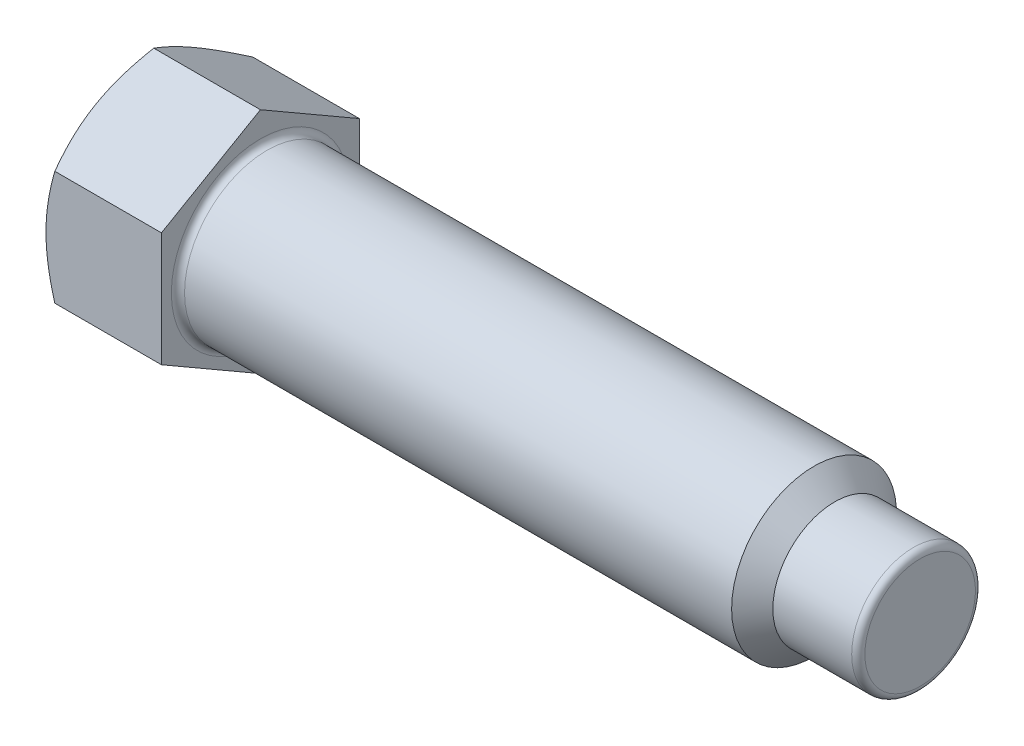
ISO-10303-21;
HEADER;
FILE_DESCRIPTION(('STEP AP214'),'2;1');
FILE_NAME('part.step','',(''),(''),'','','');
FILE_SCHEMA(('AUTOMOTIVE_DESIGN { 1 0 10303 214 1 1 1 1 }'));
ENDSEC;
DATA;
#1=APPLICATION_CONTEXT('core data for automotive mechanical design processes');
#2=APPLICATION_PROTOCOL_DEFINITION('international standard','automotive_design',2000,#1);
#3=PRODUCT_CONTEXT('',#1,'mechanical');
#4=PRODUCT('Part','Part','',(#3));
#5=PRODUCT_RELATED_PRODUCT_CATEGORY('part','',(#4));
#6=PRODUCT_DEFINITION_FORMATION('','',#4);
#7=PRODUCT_DEFINITION_CONTEXT('part definition',#1,'design');
#8=PRODUCT_DEFINITION('design','',#6,#7);
#9=PRODUCT_DEFINITION_SHAPE('','',#8);
#10=(LENGTH_UNIT() NAMED_UNIT(*) SI_UNIT(.MILLI.,.METRE.));
#11=(NAMED_UNIT(*) PLANE_ANGLE_UNIT() SI_UNIT($,.RADIAN.));
#12=(NAMED_UNIT(*) SI_UNIT($,.STERADIAN.) SOLID_ANGLE_UNIT());
#13=UNCERTAINTY_MEASURE_WITH_UNIT(LENGTH_MEASURE(1.E-05),#10,'distance_accuracy_value','');
#14=(GEOMETRIC_REPRESENTATION_CONTEXT(3) GLOBAL_UNCERTAINTY_ASSIGNED_CONTEXT((#13)) GLOBAL_UNIT_ASSIGNED_CONTEXT((#10,
#11,#12)) REPRESENTATION_CONTEXT('',''));
#15=CARTESIAN_POINT('',(0.,0.,0.));
#16=DIRECTION('',(0.,0.,1.));
#17=DIRECTION('',(1.,0.,0.));
#18=AXIS2_PLACEMENT_3D('',#15,#16,#17);
#19=CARTESIAN_POINT('',(14.,6.9282032302755,-12.));
#20=DIRECTION('',(0.,-0.866025403784438,0.500000000000001));
#21=DIRECTION('',(0.,-0.500000000000001,-0.866025403784438));
#22=AXIS2_PLACEMENT_3D('',#19,#20,#21);
#23=PLANE('',#22);
#24=CARTESIAN_POINT('',(1.07186343722447,13.8565219306049,0.0002));
#25=CARTESIAN_POINT('',(0.983949632185857,13.7042251307133,-0.263585795242263));
#26=CARTESIAN_POINT('',(0.900025997556664,13.5513604901482,-0.5283551193818));
#27=CARTESIAN_POINT('',(0.741266218872839,13.244405350712,-1.06001701652966));
#28=CARTESIAN_POINT('',(0.666433063673581,13.0903144663124,-1.32691025729307));
#29=CARTESIAN_POINT('',(0.457017539854151,12.6255589607763,-2.13189040597901));
#30=CARTESIAN_POINT('',(0.33790323672285,12.3130596590925,-2.6731550738251));
#31=CARTESIAN_POINT('',(0.198231061003145,11.8454187840152,-3.48313282915499));
#32=CARTESIAN_POINT('',(0.158443797040445,11.6916742921315,-3.74942610048137));
#33=CARTESIAN_POINT('',(0.091723369217091,11.3834734611381,-4.28324559869683));
#34=CARTESIAN_POINT('',(0.0647904527677748,11.2290171083848,-4.55077184921737));
#35=CARTESIAN_POINT('',(0.0244685919169245,10.9198468953819,-5.08627036632534));
#36=CARTESIAN_POINT('',(0.0110635528823167,10.7651335610083,-5.35424172206872));
#37=CARTESIAN_POINT('',(-0.00191690624283409,10.4555635369292,-5.89043273227403));
#38=CARTESIAN_POINT('',(-0.00149275363726694,10.3007068518009,-6.15865237880803));
#39=CARTESIAN_POINT('',(0.0122200193427709,10.011202064883,-6.6600893787841));
#40=CARTESIAN_POINT('',(0.0238359825785288,9.87653331649855,-6.89334249317775));
#41=CARTESIAN_POINT('',(0.0573080088723756,9.60750555673725,-7.35931224173076));
#42=CARTESIAN_POINT('',(0.0791647962662152,9.47314656794543,-7.59202883677176));
#43=CARTESIAN_POINT('',(0.132737416542906,9.20481134519089,-8.05679907604294));
#44=CARTESIAN_POINT('',(0.16446139249292,9.07083551994084,-8.288852012362));
#45=CARTESIAN_POINT('',(0.237211775670436,8.80351197901488,-8.75186996730497));
#46=CARTESIAN_POINT('',(0.278238815183194,8.67016430666066,-8.98283491089354));
#47=CARTESIAN_POINT('',(0.416311653281799,8.2653799638421,-9.68394195876366));
#48=CARTESIAN_POINT('',(0.52712488833932,7.99511549730955,-10.1520537462785));
#49=CARTESIAN_POINT('',(0.778625766937874,7.45861659251288,-11.0812971075914));
#50=CARTESIAN_POINT('',(0.919254342659372,7.19237528499142,-11.5424405792922));
#51=CARTESIAN_POINT('',(1.07186343722446,6.92808776022166,-12.0002));
#52=B_SPLINE_CURVE_WITH_KNOTS('',3,(#24,#25,#26,#27,#28,#29,#30,#31,#32,#33,#34,#35,#36,#37,#38,
#39,#40,#41,#42,#43,#44,#45,#46,#47,#48,#49,#50,#51),.UNSPECIFIED.,.F.,.F.,(4,2,2,2,2,2,2,2,2,2,
2,2,2,4),(0.,0.951004872251244,1.90232158356437,3.80900466161368,4.7389455141357,
5.66890426477609,6.59775529889865,7.5265776327693,8.33514643820578,9.14377244252749,
9.95306755799765,10.7624176939264,12.4167102786892,14.0677556316691),.UNSPECIFIED.);
#53=CARTESIAN_POINT('',(1.07179676972448,13.856406460551,0.));
#54=VERTEX_POINT('',#53);
#55=CARTESIAN_POINT('',(0.,10.3923048454133,-6.00000000000002));
#56=VERTEX_POINT('',#55);
#57=EDGE_CURVE('E47',#54,#56,#52,.T.);
#58=ORIENTED_EDGE('',*,*,#57,.F.);
#59=DIRECTION('',(-1.,0.,0.));
#60=VECTOR('',#59,1.);
#61=CARTESIAN_POINT('',(14.,13.856406460551,0.));
#62=LINE('',#61,#60);
#63=CARTESIAN_POINT('',(14.,13.856406460551,0.));
#64=VERTEX_POINT('',#63);
#65=EDGE_CURVE('E146',#64,#54,#62,.T.);
#66=ORIENTED_EDGE('',*,*,#65,.F.);
#67=DIRECTION('',(0.,0.500000000000001,0.866025403784438));
#68=VECTOR('',#67,1.);
#69=CARTESIAN_POINT('',(14.,6.9282032302755,-12.));
#70=LINE('',#69,#68);
#71=CARTESIAN_POINT('',(14.,6.9282032302755,-12.));
#72=VERTEX_POINT('',#71);
#73=EDGE_CURVE('E284',#72,#64,#70,.T.);
#74=ORIENTED_EDGE('',*,*,#73,.F.);
#75=DIRECTION('',(-1.,0.,0.));
#76=VECTOR('',#75,1.);
#77=CARTESIAN_POINT('',(14.,6.9282032302755,-12.));
#78=LINE('',#77,#76);
#79=CARTESIAN_POINT('',(1.07179676972447,6.9282032302755,-12.));
#80=VERTEX_POINT('',#79);
#81=EDGE_CURVE('E133',#72,#80,#78,.T.);
#82=ORIENTED_EDGE('',*,*,#81,.T.);
#83=EDGE_CURVE('E127',#56,#80,#52,.T.);
#84=ORIENTED_EDGE('',*,*,#83,.F.);
#85=EDGE_LOOP('',(#58,#66,#74,#82,#84));
#86=FACE_BOUND('',#85,.T.);
#87=ADVANCED_FACE('F32',(#86),#23,.F.);
#88=CARTESIAN_POINT('',(14.,13.856406460551,0.));
#89=DIRECTION('',(0.,-0.866025403784439,-0.5));
#90=DIRECTION('',(0.,0.5,-0.866025403784439));
#91=AXIS2_PLACEMENT_3D('',#88,#89,#90);
#92=PLANE('',#91);
#93=CARTESIAN_POINT('',(1.07186343722447,6.92808776022168,12.0002));
#94=CARTESIAN_POINT('',(0.983949632185856,7.0803845601132,11.7364142047577));
#95=CARTESIAN_POINT('',(0.900025997556663,7.23324920067831,11.4716448806182));
#96=CARTESIAN_POINT('',(0.741266218872838,7.5402043401145,10.9399829834703));
#97=CARTESIAN_POINT('',(0.666433063673581,7.69429522451415,10.6730897427069));
#98=CARTESIAN_POINT('',(0.457017539854151,8.15905073005028,9.86810959402099));
#99=CARTESIAN_POINT('',(0.337903236722851,8.47155003173405,9.3268449261749));
#100=CARTESIAN_POINT('',(0.198231061003146,8.93919090681138,8.51686717084501));
#101=CARTESIAN_POINT('',(0.158443797040447,9.09293539869505,8.25057389951863));
#102=CARTESIAN_POINT('',(0.0917233692170934,9.40113622968842,7.71675440130316));
#103=CARTESIAN_POINT('',(0.0647904527677778,9.55559258244174,7.44922815078262));
#104=CARTESIAN_POINT('',(0.024468591916929,9.86476279544467,6.91372963367465));
#105=CARTESIAN_POINT('',(0.0110635528823219,10.0194761298182,6.64575827793128));
#106=CARTESIAN_POINT('',(-0.00191690624282825,10.3290461538973,6.10956726772596));
#107=CARTESIAN_POINT('',(-0.00149275363726122,10.4839028390257,5.84134762119196));
#108=CARTESIAN_POINT('',(0.0122200193427771,10.7734076259435,5.3399106212159));
#109=CARTESIAN_POINT('',(0.0238359825785356,10.908076374328,5.10665750682225));
#110=CARTESIAN_POINT('',(0.057308008872383,11.1771041340893,4.64068775826924));
#111=CARTESIAN_POINT('',(0.0791647962662228,11.3114631228811,4.40797116322823));
#112=CARTESIAN_POINT('',(0.132737416542915,11.5797983456356,3.94320092395706));
#113=CARTESIAN_POINT('',(0.164461392492929,11.7137741708857,3.711147987638));
#114=CARTESIAN_POINT('',(0.237211775670445,11.9810977118116,3.24813003269502));
#115=CARTESIAN_POINT('',(0.278238815183202,12.1144453841659,3.01716508910646));
#116=CARTESIAN_POINT('',(0.416311653281805,12.5192297269844,2.31605804123633));
#117=CARTESIAN_POINT('',(0.527124888339327,12.789494193517,1.84794625372147));
#118=CARTESIAN_POINT('',(0.778625766937884,13.3259930983136,0.91870289240858));
#119=CARTESIAN_POINT('',(0.919254342659383,13.5922344058351,0.457559420707848));
#120=CARTESIAN_POINT('',(1.07186343722447,13.8565219306049,-0.000199999999998182));
#121=B_SPLINE_CURVE_WITH_KNOTS('',3,(#93,#94,#95,#96,#97,#98,#99,#100,#101,#102,#103,#104,#105,
#106,#107,#108,#109,#110,#111,#112,#113,#114,#115,#116,#117,#118,#119,#120),.UNSPECIFIED.,.F.,
.F.,(4,2,2,2,2,2,2,2,2,2,2,2,2,4),(0.,0.951004872251244,1.90232158356437,3.80900466161368,
4.7389455141357,5.66890426477609,6.59775529889865,7.5265776327693,8.33514643820578,
9.14377244252749,9.95306755799765,10.7624176939264,12.4167102786892,14.0677556316691),.UNSPECIFIED.);
#122=CARTESIAN_POINT('',(1.07179676972448,6.92820323027552,12.));
#123=VERTEX_POINT('',#122);
#124=CARTESIAN_POINT('',(0.,10.3923048454133,6.));
#125=VERTEX_POINT('',#124);
#126=EDGE_CURVE('E55',#123,#125,#121,.T.);
#127=ORIENTED_EDGE('',*,*,#126,.F.);
#128=DIRECTION('',(-1.,0.,0.));
#129=VECTOR('',#128,1.);
#130=CARTESIAN_POINT('',(14.,6.92820323027552,12.));
#131=LINE('',#130,#129);
#132=CARTESIAN_POINT('',(14.,6.92820323027552,12.));
#133=VERTEX_POINT('',#132);
#134=EDGE_CURVE('E143',#133,#123,#131,.T.);
#135=ORIENTED_EDGE('',*,*,#134,.F.);
#136=DIRECTION('',(0.,-0.5,0.866025403784439));
#137=VECTOR('',#136,1.);
#138=CARTESIAN_POINT('',(14.,13.856406460551,0.));
#139=LINE('',#138,#137);
#140=EDGE_CURVE('E286',#64,#133,#139,.T.);
#141=ORIENTED_EDGE('',*,*,#140,.F.);
#142=ORIENTED_EDGE('',*,*,#65,.T.);
#143=EDGE_CURVE('E221',#125,#54,#121,.T.);
#144=ORIENTED_EDGE('',*,*,#143,.F.);
#145=EDGE_LOOP('',(#127,#135,#141,#142,#144));
#146=FACE_BOUND('',#145,.T.);
#147=ADVANCED_FACE('F173',(#146),#92,.F.);
#148=CARTESIAN_POINT('',(14.,6.92820323027552,12.));
#149=DIRECTION('',(0.,0.,-1.));
#150=DIRECTION('',(-1.,0.,0.));
#151=AXIS2_PLACEMENT_3D('',#148,#149,#150);
#152=PLANE('',#151);
#153=CARTESIAN_POINT('',(5.93796522499153,-18.7780422876809,12.));
#154=CARTESIAN_POINT('',(5.81013580153164,-18.5152821742341,12.));
#155=CARTESIAN_POINT('',(5.68293119845558,-18.2522182359297,12.));
#156=CARTESIAN_POINT('',(5.4299128141003,-17.7254193681017,12.));
#157=CARTESIAN_POINT('',(5.30409904630049,-17.4616844321054,12.));
#158=CARTESIAN_POINT('',(4.92892368290869,-16.6693101743881,12.));
#159=CARTESIAN_POINT('',(4.68186469152989,-16.1395765656331,12.));
#160=CARTESIAN_POINT('',(4.19405479952977,-15.0738169190077,12.));
#161=CARTESIAN_POINT('',(3.95334413341021,-14.5377724221017,12.));
#162=CARTESIAN_POINT('',(3.48154718674619,-13.461479060208,12.));
#163=CARTESIAN_POINT('',(3.25046046260961,-12.9212303903669,12.));
#164=CARTESIAN_POINT('',(2.79294900667125,-11.8175688689819,12.));
#165=CARTESIAN_POINT('',(2.56693655895498,-11.2539842320577,12.));
#166=CARTESIAN_POINT('',(2.1316128327316,-10.1202797331247,12.));
#167=CARTESIAN_POINT('',(1.92230340506568,-9.55015915485904,12.));
#168=CARTESIAN_POINT('',(1.52576124918551,-8.40350794466344,12.));
#169=CARTESIAN_POINT('',(1.33848523718243,-7.82699240007885,12.));
#170=CARTESIAN_POINT('',(0.991896700180043,-6.66563869600159,12.));
#171=CARTESIAN_POINT('',(0.832575542892151,-6.08080316618916,12.));
#172=CARTESIAN_POINT('',(0.620681197025559,-5.19882791551968,12.));
#173=CARTESIAN_POINT('',(0.554713150855279,-4.90488790342144,12.));
#174=CARTESIAN_POINT('',(0.432574422995972,-4.31496880701139,12.));
#175=CARTESIAN_POINT('',(0.376403548449431,-4.01898976295722,12.));
#176=CARTESIAN_POINT('',(0.274840044165102,-3.42518449183523,12.));
#177=CARTESIAN_POINT('',(0.229447213467058,-3.12735829931438,12.));
#178=CARTESIAN_POINT('',(0.150338666864209,-2.5301603353483,12.));
#179=CARTESIAN_POINT('',(0.116622484244824,-2.23078862616277,12.));
#180=CARTESIAN_POINT('',(0.0619693201283194,-1.63489952034462,12.));
#181=CARTESIAN_POINT('',(0.0408679219512408,-1.33839729705373,12.));
#182=CARTESIAN_POINT('',(0.011231051902193,-0.744766224338106,12.));
#183=CARTESIAN_POINT('',(0.00269536679662676,-0.447637385632403,12.));
#184=CARTESIAN_POINT('',(-0.00160621157202279,0.146715096942947,12.));
#185=CARTESIAN_POINT('',(0.00262788821472256,0.443938740760907,12.));
#186=CARTESIAN_POINT('',(0.0237602868313385,1.03793867900078,12.));
#187=CARTESIAN_POINT('',(0.0406591751133814,1.33471495195668,12.));
#188=CARTESIAN_POINT('',(0.0957363037225956,2.04293812544913,12.));
#189=CARTESIAN_POINT('',(0.139644388869436,2.45394931182507,12.));
#190=CARTESIAN_POINT('',(0.249393763135937,3.27301119833397,12.));
#191=CARTESIAN_POINT('',(0.315237895547365,3.68106150767662,12.));
#192=CARTESIAN_POINT('',(0.542190666924397,4.90025554060109,12.));
#193=CARTESIAN_POINT('',(0.732681274216213,5.70600726238714,12.));
#194=CARTESIAN_POINT('',(1.06415793334629,6.9110176011861,12.));
#195=CARTESIAN_POINT('',(1.18384338751809,7.31649624625241,12.));
#196=CARTESIAN_POINT('',(1.43593551476423,8.12351840181158,12.));
#197=CARTESIAN_POINT('',(1.56834227450982,8.52506188547334,12.));
#198=CARTESIAN_POINT('',(1.84372865812762,9.32433402651673,12.));
#199=CARTESIAN_POINT('',(1.98670500371922,9.72206382387904,12.));
#200=CARTESIAN_POINT('',(2.28151949374366,10.514209106185,12.));
#201=CARTESIAN_POINT('',(2.43335751674012,10.9086246364612,12.));
#202=CARTESIAN_POINT('',(2.81137815071348,11.8636440545742,12.));
#203=CARTESIAN_POINT('',(3.04143185567878,12.4227131308579,12.));
#204=CARTESIAN_POINT('',(3.51333410611207,13.5358669332654,12.));
#205=CARTESIAN_POINT('',(3.75518348678293,14.0899513031432,12.));
#206=CARTESIAN_POINT('',(4.24823475653158,15.1941025186568,12.));
#207=CARTESIAN_POINT('',(4.49943904043689,15.7441682918316,12.));
#208=CARTESIAN_POINT('',(5.00924552887372,16.840834953602,12.));
#209=CARTESIAN_POINT('',(5.26784754956298,17.38743592789,12.));
#210=CARTESIAN_POINT('',(5.79133879928481,18.4784293923003,12.));
#211=CARTESIAN_POINT('',(6.05623527465221,19.0228183989983,12.));
#212=CARTESIAN_POINT('',(6.59090796254076,20.1091945794084,12.));
#213=CARTESIAN_POINT('',(6.86068419945744,20.651181741096,12.));
#214=CARTESIAN_POINT('',(7.40421496208663,21.7330545936329,12.));
#215=CARTESIAN_POINT('',(7.67796889125698,22.2729405845112,12.));
#216=CARTESIAN_POINT('',(8.22882461462081,23.351002874205,12.));
#217=CARTESIAN_POINT('',(8.50592642242825,23.8891791660569,12.));
#218=CARTESIAN_POINT('',(9.29226596146121,25.4066579940568,12.));
#219=CARTESIAN_POINT('',(9.8047565962353,26.3842748096139,12.));
#220=CARTESIAN_POINT('',(10.8366490575023,28.3358962609435,12.));
#221=CARTESIAN_POINT('',(11.3560511647271,29.3099007479223,12.));
#222=CARTESIAN_POINT('',(12.3986980712295,31.2524398572293,12.));
#223=CARTESIAN_POINT('',(12.9219285874181,32.2209821512088,12.));
#224=CARTESIAN_POINT('',(13.709817261168,33.6721037842398,12.));
#225=CARTESIAN_POINT('',(13.9729461083085,34.1555146940214,12.));
#226=CARTESIAN_POINT('',(14.5001155834575,35.1218381868037,12.));
#227=CARTESIAN_POINT('',(14.7641562100751,35.6047507705632,12.));
#228=CARTESIAN_POINT('',(15.0285993289472,36.087442911269,12.));
#229=B_SPLINE_CURVE_WITH_KNOTS('',3,(#153,#154,#155,#156,#157,#158,#159,#160,#161,#162,#163,
#164,#165,#166,#167,#168,#169,#170,#171,#172,#173,#174,#175,#176,#177,#178,#179,#180,#181,#182,
#183,#184,#185,#186,#187,#188,#189,#190,#191,#192,#193,#194,#195,#196,#197,#198,#199,#200,#201,
#202,#203,#204,#205,#206,#207,#208,#209,#210,#211,#212,#213,#214,#215,#216,#217,#218,#219,#220,
#221,#222,#223,#224,#225,#226,#227,#228),.UNSPECIFIED.,.F.,.F.,(4,2,2,2,2,2,2,2,2,2,2,2,2,2,2,2,
2,2,2,2,2,2,2,2,2,2,2,2,2,2,2,2,2,2,2,2,2,4),(0.,0.876610778943412,1.75323004620523,
3.50671945197806,5.26947518067904,7.03214956933032,8.85359042595664,10.6752328347611,
12.4932347351832,14.3106742559303,15.2142921518805,16.117892258087,17.0214755150421,
17.9250226516858,18.8165208716869,19.7080039632538,20.5994865696161,21.4910106704728,
22.7303633484054,23.9698767304575,26.4502079763428,27.7184187234137,28.9866381115162,
30.2544657836992,31.5222760862276,33.3357454112636,35.1493433274816,36.9634087547281,
38.7774291394607,40.5936500751824,42.4098800933003,44.2258404831105,46.0418082599001,
49.3531754129826,52.664677481008,55.9671781132062,57.6183303465534,59.2694800621133),.UNSPECIFIED.);
#230=CARTESIAN_POINT('',(1.07179676972447,-6.92820323027549,12.));
#231=VERTEX_POINT('',#230);
#232=CARTESIAN_POINT('',(0.,0.,12.));
#233=VERTEX_POINT('',#232);
#234=EDGE_CURVE('E230',#231,#233,#229,.T.);
#235=ORIENTED_EDGE('',*,*,#234,.F.);
#236=DIRECTION('',(-1.,0.,0.));
#237=VECTOR('',#236,1.);
#238=CARTESIAN_POINT('',(14.,-6.92820323027549,12.));
#239=LINE('',#238,#237);
#240=CARTESIAN_POINT('',(14.,-6.92820323027549,12.));
#241=VERTEX_POINT('',#240);
#242=EDGE_CURVE('E135',#241,#231,#239,.T.);
#243=ORIENTED_EDGE('',*,*,#242,.F.);
#244=DIRECTION('',(0.,-1.,0.));
#245=VECTOR('',#244,1.);
#246=CARTESIAN_POINT('',(14.,6.92820323027552,12.));
#247=LINE('',#246,#245);
#248=EDGE_CURVE('E289',#133,#241,#247,.T.);
#249=ORIENTED_EDGE('',*,*,#248,.F.);
#250=ORIENTED_EDGE('',*,*,#134,.T.);
#251=EDGE_CURVE('E225',#233,#123,#229,.T.);
#252=ORIENTED_EDGE('',*,*,#251,.F.);
#253=EDGE_LOOP('',(#235,#243,#249,#250,#252));
#254=FACE_BOUND('',#253,.T.);
#255=ADVANCED_FACE('F179',(#254),#152,.F.);
#256=CARTESIAN_POINT('',(14.,-13.856406460551,0.));
#257=DIRECTION('',(0.,0.866025403784437,-0.500000000000002));
#258=DIRECTION('',(0.,0.500000000000002,0.866025403784437));
#259=AXIS2_PLACEMENT_3D('',#256,#257,#258);
#260=PLANE('',#259);
#261=CARTESIAN_POINT('',(1.07186343722448,-13.8565219306049,-0.000200000000000038));
#262=CARTESIAN_POINT('',(0.983949632185864,-13.7042251307134,0.263585795242262));
#263=CARTESIAN_POINT('',(0.900025997556671,-13.5513604901482,0.528355119381799));
#264=CARTESIAN_POINT('',(0.741266218872846,-13.2444053507121,1.06001701652966));
#265=CARTESIAN_POINT('',(0.666433063673588,-13.0903144663124,1.32691025729307));
#266=CARTESIAN_POINT('',(0.457017539854158,-12.6255589607763,2.13189040597901));
#267=CARTESIAN_POINT('',(0.337903236722855,-12.3130596590925,2.6731550738251));
#268=CARTESIAN_POINT('',(0.198231061003148,-11.8454187840152,3.48313282915499));
#269=CARTESIAN_POINT('',(0.158443797040449,-11.6916742921315,3.74942610048137));
#270=CARTESIAN_POINT('',(0.0917233692170945,-11.3834734611381,4.28324559869684));
#271=CARTESIAN_POINT('',(0.0647904527677789,-11.2290171083848,4.55077184921738));
#272=CARTESIAN_POINT('',(0.0244685919169284,-10.9198468953819,5.08627036632535));
#273=CARTESIAN_POINT('',(0.0110635528823198,-10.7651335610083,5.35424172206872));
#274=CARTESIAN_POINT('',(-0.00191690624283167,-10.4555635369292,5.89043273227403));
#275=CARTESIAN_POINT('',(-0.0014927536372644,-10.3007068518009,6.15865237880803));
#276=CARTESIAN_POINT('',(0.0122200193427734,-10.0112020648831,6.6600893787841));
#277=CARTESIAN_POINT('',(0.0238359825785312,-9.87653331649856,6.89334249317775));
#278=CARTESIAN_POINT('',(0.0573080088723783,-9.60750555673725,7.35931224173077));
#279=CARTESIAN_POINT('',(0.0791647962662184,-9.47314656794544,7.59202883677177));
#280=CARTESIAN_POINT('',(0.132737416542909,-9.2048113451909,8.05679907604294));
#281=CARTESIAN_POINT('',(0.164461392492923,-9.07083551994084,8.288852012362));
#282=CARTESIAN_POINT('',(0.237211775670439,-8.80351197901488,8.75186996730498));
#283=CARTESIAN_POINT('',(0.278238815183195,-8.67016430666066,8.98283491089354));
#284=CARTESIAN_POINT('',(0.416311653281799,-8.2653799638421,9.68394195876367));
#285=CARTESIAN_POINT('',(0.52712488833932,-7.99511549730955,10.1520537462785));
#286=CARTESIAN_POINT('',(0.778625766937875,-7.45861659251288,11.0812971075914));
#287=CARTESIAN_POINT('',(0.919254342659373,-7.19237528499142,11.5424405792922));
#288=CARTESIAN_POINT('',(1.07186343722446,-6.92808776022166,12.0002));
#289=B_SPLINE_CURVE_WITH_KNOTS('',3,(#261,#262,#263,#264,#265,#266,#267,#268,#269,#270,#271,
#272,#273,#274,#275,#276,#277,#278,#279,#280,#281,#282,#283,#284,#285,#286,#287,#288),
.UNSPECIFIED.,.F.,.F.,(4,2,2,2,2,2,2,2,2,2,2,2,2,4),(0.,0.951004872251247,1.90232158356438,
3.80900466161369,4.7389455141357,5.66890426477609,6.59775529889866,7.52657763276931,
8.33514643820579,9.1437724425275,9.95306755799766,10.7624176939264,12.4167102786892,
14.0677556316691),.UNSPECIFIED.);
#290=CARTESIAN_POINT('',(1.07179676972449,-13.856406460551,0.));
#291=VERTEX_POINT('',#290);
#292=CARTESIAN_POINT('',(0.,-10.3923048454132,6.00000000000002));
#293=VERTEX_POINT('',#292);
#294=EDGE_CURVE('E195',#291,#293,#289,.T.);
#295=ORIENTED_EDGE('',*,*,#294,.F.);
#296=DIRECTION('',(-1.,0.,0.));
#297=VECTOR('',#296,1.);
#298=CARTESIAN_POINT('',(14.,-13.856406460551,0.));
#299=LINE('',#298,#297);
#300=CARTESIAN_POINT('',(14.,-13.856406460551,0.));
#301=VERTEX_POINT('',#300);
#302=EDGE_CURVE('E132',#301,#291,#299,.T.);
#303=ORIENTED_EDGE('',*,*,#302,.F.);
#304=DIRECTION('',(0.,-0.500000000000002,-0.866025403784437));
#305=VECTOR('',#304,1.);
#306=CARTESIAN_POINT('',(14.,-13.856406460551,0.));
#307=LINE('',#306,#305);
#308=EDGE_CURVE('E294',#241,#301,#307,.T.);
#309=ORIENTED_EDGE('',*,*,#308,.F.);
#310=ORIENTED_EDGE('',*,*,#242,.T.);
#311=EDGE_CURVE('E231',#293,#231,#289,.T.);
#312=ORIENTED_EDGE('',*,*,#311,.F.);
#313=EDGE_LOOP('',(#295,#303,#309,#310,#312));
#314=FACE_BOUND('',#313,.T.);
#315=ADVANCED_FACE('F236',(#314),#260,.F.);
#316=CARTESIAN_POINT('',(14.,-6.92820323027553,-12.));
#317=DIRECTION('',(0.,0.866025403784438,0.5));
#318=DIRECTION('',(0.,-0.5,0.866025403784439));
#319=AXIS2_PLACEMENT_3D('',#316,#317,#318);
#320=PLANE('',#319);
#321=CARTESIAN_POINT('',(1.07186343722447,-6.92808776022169,-12.0002));
#322=CARTESIAN_POINT('',(0.983949632185859,-7.08038456011321,-11.7364142047577));
#323=CARTESIAN_POINT('',(0.900025997556666,-7.23324920067832,-11.4716448806182));
#324=CARTESIAN_POINT('',(0.741266218872841,-7.54020434011451,-10.9399829834703));
#325=CARTESIAN_POINT('',(0.666433063673584,-7.69429522451416,-10.6730897427069));
#326=CARTESIAN_POINT('',(0.457017539854154,-8.15905073005029,-9.86810959402099));
#327=CARTESIAN_POINT('',(0.337903236722854,-8.47155003173406,-9.3268449261749));
#328=CARTESIAN_POINT('',(0.198231061003151,-8.93919090681139,-8.516867170845));
#329=CARTESIAN_POINT('',(0.158443797040452,-9.09293539869506,-8.25057389951863));
#330=CARTESIAN_POINT('',(0.0917233692170985,-9.40113622968843,-7.71675440130316));
#331=CARTESIAN_POINT('',(0.0647904527677828,-9.55559258244175,-7.44922815078262));
#332=CARTESIAN_POINT('',(0.024468591916934,-9.86476279544469,-6.91372963367465));
#333=CARTESIAN_POINT('',(0.011063552882327,-10.0194761298182,-6.64575827793127));
#334=CARTESIAN_POINT('',(-0.00191690624282283,-10.3290461538973,-6.10956726772596));
#335=CARTESIAN_POINT('',(-0.00149275363725555,-10.4839028390257,-5.84134762119196));
#336=CARTESIAN_POINT('',(0.0122200193427835,-10.7734076259435,-5.3399106212159));
#337=CARTESIAN_POINT('',(0.0238359825785423,-10.908076374328,-5.10665750682225));
#338=CARTESIAN_POINT('',(0.0573080088723902,-11.1771041340893,-4.64068775826923));
#339=CARTESIAN_POINT('',(0.07916479626623,-11.3114631228811,-4.40797116322823));
#340=CARTESIAN_POINT('',(0.132737416542921,-11.5797983456357,-3.94320092395706));
#341=CARTESIAN_POINT('',(0.164461392492935,-11.7137741708857,-3.711147987638));
#342=CARTESIAN_POINT('',(0.237211775670452,-11.9810977118117,-3.24813003269502));
#343=CARTESIAN_POINT('',(0.278238815183209,-12.1144453841659,-3.01716508910646));
#344=CARTESIAN_POINT('',(0.416311653281813,-12.5192297269844,-2.31605804123633));
#345=CARTESIAN_POINT('',(0.527124888339336,-12.789494193517,-1.84794625372147));
#346=CARTESIAN_POINT('',(0.778625766937892,-13.3259930983137,-0.918702892408578));
#347=CARTESIAN_POINT('',(0.91925434265939,-13.5922344058351,-0.457559420707847));
#348=CARTESIAN_POINT('',(1.07186343722448,-13.8565219306049,0.000199999999998666));
#349=B_SPLINE_CURVE_WITH_KNOTS('',3,(#321,#322,#323,#324,#325,#326,#327,#328,#329,#330,#331,
#332,#333,#334,#335,#336,#337,#338,#339,#340,#341,#342,#343,#344,#345,#346,#347,#348),
.UNSPECIFIED.,.F.,.F.,(4,2,2,2,2,2,2,2,2,2,2,2,2,4),(0.,0.951004872251244,1.90232158356437,
3.80900466161368,4.7389455141357,5.66890426477609,6.59775529889865,7.5265776327693,
8.33514643820578,9.14377244252749,9.95306755799765,10.7624176939264,12.4167102786892,
14.0677556316691),.UNSPECIFIED.);
#350=CARTESIAN_POINT('',(1.07179676972448,-6.92820323027553,-12.));
#351=VERTEX_POINT('',#350);
#352=CARTESIAN_POINT('',(0.,-10.3923048454133,-6.));
#353=VERTEX_POINT('',#352);
#354=EDGE_CURVE('E108',#351,#353,#349,.T.);
#355=ORIENTED_EDGE('',*,*,#354,.F.);
#356=DIRECTION('',(-1.,0.,0.));
#357=VECTOR('',#356,1.);
#358=CARTESIAN_POINT('',(14.,-6.92820323027553,-12.));
#359=LINE('',#358,#357);
#360=CARTESIAN_POINT('',(14.,-6.92820323027553,-12.));
#361=VERTEX_POINT('',#360);
#362=EDGE_CURVE('E123',#361,#351,#359,.T.);
#363=ORIENTED_EDGE('',*,*,#362,.F.);
#364=DIRECTION('',(0.,0.5,-0.866025403784439));
#365=VECTOR('',#364,1.);
#366=CARTESIAN_POINT('',(14.,-6.92820323027553,-12.));
#367=LINE('',#366,#365);
#368=EDGE_CURVE('E296',#301,#361,#367,.T.);
#369=ORIENTED_EDGE('',*,*,#368,.F.);
#370=ORIENTED_EDGE('',*,*,#302,.T.);
#371=EDGE_CURVE('E126',#353,#291,#349,.T.);
#372=ORIENTED_EDGE('',*,*,#371,.F.);
#373=EDGE_LOOP('',(#355,#363,#369,#370,#372));
#374=FACE_BOUND('',#373,.T.);
#375=ADVANCED_FACE('F121',(#374),#320,.F.);
#376=CARTESIAN_POINT('',(14.,6.9282032302755,-12.));
#377=DIRECTION('',(0.,0.,1.));
#378=DIRECTION('',(0.,-1.,0.));
#379=AXIS2_PLACEMENT_3D('',#376,#377,#378);
#380=PLANE('',#379);
#381=CARTESIAN_POINT('',(5.93796522688048,-18.7780422915637,-12.));
#382=CARTESIAN_POINT('',(5.81013580338117,-18.5152821780516,-12.));
#383=CARTESIAN_POINT('',(5.68293120026572,-18.2522182396819,-12.));
#384=CARTESIAN_POINT('',(5.42991281583172,-17.7254193717232,-12.));
#385=CARTESIAN_POINT('',(5.30409904799258,-17.4616844356616,-12.));
#386=CARTESIAN_POINT('',(4.92892368448291,-16.669310177748,-12.));
#387=CARTESIAN_POINT('',(4.68186469302572,-16.139576568862,-12.));
#388=CARTESIAN_POINT('',(4.19405480086876,-15.0738169219725,-12.));
#389=CARTESIAN_POINT('',(3.95334413467078,-14.5377724249334,-12.));
#390=CARTESIAN_POINT('',(3.48154718785119,-13.4614790627728,-12.));
#391=CARTESIAN_POINT('',(3.25046046363748,-12.9212303927976,-12.));
#392=CARTESIAN_POINT('',(2.7929490075426,-11.8175688711343,-12.));
#393=CARTESIAN_POINT('',(2.56693655974712,-11.2539842340656,-12.));
#394=CARTESIAN_POINT('',(2.13161283336956,-10.1202797348412,-12.));
#395=CARTESIAN_POINT('',(1.92230340562866,-9.55015915642869,-12.));
#396=CARTESIAN_POINT('',(1.52576124960571,-8.40350794593667,-12.));
#397=CARTESIAN_POINT('',(1.33848523753482,-7.82699240120253,-12.));
#398=CARTESIAN_POINT('',(0.991896700407868,-6.66563869682203,-12.));
#399=CARTESIAN_POINT('',(0.83257554306322,-6.08080316685593,-12.));
#400=CARTESIAN_POINT('',(0.620681197115221,-5.19882791591538,-12.));
#401=CARTESIAN_POINT('',(0.554713150915097,-4.90488790370126,-12.));
#402=CARTESIAN_POINT('',(0.432574423003697,-4.3149688070578,-12.));
#403=CARTESIAN_POINT('',(0.376403548434908,-4.01898976288609,-12.));
#404=CARTESIAN_POINT('',(0.274840044114867,-3.42518449152774,-12.));
#405=CARTESIAN_POINT('',(0.229447213403355,-3.12735829888806,-12.));
#406=CARTESIAN_POINT('',(0.150338666783349,-2.53016033468332,-12.));
#407=CARTESIAN_POINT('',(0.116622484160274,-2.23078862537795,-12.));
#408=CARTESIAN_POINT('',(0.0619693200469847,-1.63489951932263,-12.));
#409=CARTESIAN_POINT('',(0.040867921876617,-1.33839729591442,-12.));
#410=CARTESIAN_POINT('',(0.0112310518513523,-0.744766222964399,-12.));
#411=CARTESIAN_POINT('',(0.00269536676285804,-0.447637384141611,-12.));
#412=CARTESIAN_POINT('',(-0.00160621156152653,0.146715098667033,-12.));
#413=CARTESIAN_POINT('',(0.00262788825241379,0.443938742601202,-12.));
#414=CARTESIAN_POINT('',(0.0237602869328196,1.03793868107198,-12.));
#415=CARTESIAN_POINT('',(0.0406591752514585,1.33471495414257,-12.));
#416=CARTESIAN_POINT('',(0.0957363039506862,2.04293812781233,-12.));
#417=CARTESIAN_POINT('',(0.139644389149357,2.45394931425036,-12.));
#418=CARTESIAN_POINT('',(0.249393763522293,3.27301120088065,-12.));
#419=CARTESIAN_POINT('',(0.315237895988329,3.68106151028259,-12.));
#420=CARTESIAN_POINT('',(0.542190667530327,4.90025554338171,-12.));
#421=CARTESIAN_POINT('',(0.732681274933577,5.70600726527964,-12.));
#422=CARTESIAN_POINT('',(1.06415793422806,6.91101760424588,-12.));
#423=CARTESIAN_POINT('',(1.18384338845501,7.3164962493691,-12.));
#424=CARTESIAN_POINT('',(1.43593551580978,8.12351840504145,-12.));
#425=CARTESIAN_POINT('',(1.56834227560885,8.52506188875948,-12.));
#426=CARTESIAN_POINT('',(1.8437286593317,9.32433402991501,-12.));
#427=CARTESIAN_POINT('',(1.98670500497486,9.72206382733319,-12.));
#428=CARTESIAN_POINT('',(2.28151949510066,10.5142091097509,-12.));
#429=CARTESIAN_POINT('',(2.43335751814691,10.9086246400829,-12.));
#430=CARTESIAN_POINT('',(2.81137815220014,11.863644058233,-12.));
#431=CARTESIAN_POINT('',(3.04143185719198,12.422713134499,-12.));
#432=CARTESIAN_POINT('',(3.51333410767187,13.5358669368732,-12.));
#433=CARTESIAN_POINT('',(3.7551834883628,14.0899513067354,-12.));
#434=CARTESIAN_POINT('',(4.24823475814662,15.1941025222193,-12.));
#435=CARTESIAN_POINT('',(4.49943904206706,15.7441682953802,-12.));
#436=CARTESIAN_POINT('',(5.00924553053046,16.8408349571241,-12.));
#437=CARTESIAN_POINT('',(5.26784755123117,17.3874359313996,-12.));
#438=CARTESIAN_POINT('',(5.79133880097282,18.4784293957853,-12.));
#439=CARTESIAN_POINT('',(6.05623527634858,19.0228184024714,-12.));
#440=CARTESIAN_POINT('',(6.59090796425168,20.1091945828585,-12.));
#441=CARTESIAN_POINT('',(6.86068420117455,20.6511817445351,-12.));
#442=CARTESIAN_POINT('',(7.40421496381446,21.7330545970508,-12.));
#443=CARTESIAN_POINT('',(7.67796889298933,22.2729405879189,-12.));
#444=CARTESIAN_POINT('',(8.2288246163609,23.3510028775931,-12.));
#445=CARTESIAN_POINT('',(8.50592642417155,23.8891791694355,-12.));
#446=CARTESIAN_POINT('',(9.29226596321904,25.4066579974227,-12.));
#447=CARTESIAN_POINT('',(9.80475659800335,26.3842748129772,-12.));
#448=CARTESIAN_POINT('',(10.8366490592886,28.3358962643027,-12.));
#449=CARTESIAN_POINT('',(11.3560511665214,29.3099007512799,-12.));
#450=CARTESIAN_POINT('',(12.3986980730395,31.252439860587,-12.));
#451=CARTESIAN_POINT('',(12.9219285892359,32.2209821545683,-12.));
#452=CARTESIAN_POINT('',(13.7098172629967,33.6721037876023,-12.));
#453=CARTESIAN_POINT('',(13.9729461101407,34.155514697385,-12.));
#454=CARTESIAN_POINT('',(14.5001155852965,35.1218381901696,-12.));
#455=CARTESIAN_POINT('',(14.7641562119173,35.6047507739303,-12.));
#456=CARTESIAN_POINT('',(15.0285993307926,36.0874429146373,-12.));
#457=B_SPLINE_CURVE_WITH_KNOTS('',3,(#381,#382,#383,#384,#385,#386,#387,#388,#389,#390,#391,
#392,#393,#394,#395,#396,#397,#398,#399,#400,#401,#402,#403,#404,#405,#406,#407,#408,#409,#410,
#411,#412,#413,#414,#415,#416,#417,#418,#419,#420,#421,#422,#423,#424,#425,#426,#427,#428,#429,
#430,#431,#432,#433,#434,#435,#436,#437,#438,#439,#440,#441,#442,#443,#444,#445,#446,#447,#448,
#449,#450,#451,#452,#453,#454,#455,#456),.UNSPECIFIED.,.F.,.F.,(4,2,2,2,2,2,2,2,2,2,2,2,2,2,2,2,
2,2,2,2,2,2,2,2,2,2,2,2,2,2,2,2,2,2,2,2,2,4),(0.,0.876610779171208,1.75323004666082,
3.50671945288931,5.26947518205081,7.03214957116258,8.85359042827971,10.6752328375751,
12.4932347384866,14.3106742597227,15.2142921560315,16.1178922625966,17.02147551991,
17.9250226569119,18.8165208772623,19.7080039691785,20.5994865758902,21.4910106770964,
22.7303633552307,23.9698767374844,26.4502079837738,27.7184187310554,28.9866381193685,
30.2544657917616,31.5222760945002,33.3357454195176,35.1493433357169,36.9634087629441,
38.7774291476574,40.5936500833579,42.4098801014545,44.2258404912437,46.0418082680123,
49.3531754211021,52.6646774891347,55.9671781213485,57.6183303547036,59.2694800702715),.UNSPECIFIED.);
#458=CARTESIAN_POINT('',(0.,0.,-12.));
#459=VERTEX_POINT('',#458);
#460=EDGE_CURVE('E115',#80,#459,#457,.F.);
#461=ORIENTED_EDGE('',*,*,#460,.F.);
#462=ORIENTED_EDGE('',*,*,#81,.F.);
#463=DIRECTION('',(0.,1.,0.));
#464=VECTOR('',#463,1.);
#465=CARTESIAN_POINT('',(14.,6.9282032302755,-12.));
#466=LINE('',#465,#464);
#467=EDGE_CURVE('E131',#361,#72,#466,.T.);
#468=ORIENTED_EDGE('',*,*,#467,.F.);
#469=ORIENTED_EDGE('',*,*,#362,.T.);
#470=EDGE_CURVE('E105',#459,#351,#457,.F.);
#471=ORIENTED_EDGE('',*,*,#470,.F.);
#472=EDGE_LOOP('',(#461,#462,#468,#469,#471));
#473=FACE_BOUND('',#472,.T.);
#474=ADVANCED_FACE('F129',(#473),#380,.F.);
#475=CARTESIAN_POINT('',(14.,0.,-24.));
#476=DIRECTION('',(1.,0.,0.));
#477=DIRECTION('',(0.,0.,-1.));
#478=AXIS2_PLACEMENT_3D('',#475,#476,#477);
#479=PLANE('',#478);
#480=CARTESIAN_POINT('',(14.,0.,0.));
#481=DIRECTION('',(1.,0.,0.));
#482=DIRECTION('',(0.,0.,-1.));
#483=AXIS2_PLACEMENT_3D('',#480,#481,#482);
#484=CIRCLE('',#483,10.8);
#485=CARTESIAN_POINT('',(14.,0.,-10.8));
#486=VERTEX_POINT('',#485);
#487=EDGE_CURVE('E152',#486,#486,#484,.F.);
#488=ORIENTED_EDGE('',*,*,#487,.T.);
#489=EDGE_LOOP('',(#488));
#490=FACE_BOUND('',#489,.T.);
#491=ORIENTED_EDGE('',*,*,#73,.T.);
#492=ORIENTED_EDGE('',*,*,#140,.T.);
#493=ORIENTED_EDGE('',*,*,#248,.T.);
#494=ORIENTED_EDGE('',*,*,#308,.T.);
#495=ORIENTED_EDGE('',*,*,#368,.T.);
#496=ORIENTED_EDGE('',*,*,#467,.T.);
#497=EDGE_LOOP('',(#491,#492,#493,#494,#495,#496));
#498=FACE_BOUND('',#497,.T.);
#499=ADVANCED_FACE('F246',(#490,#498),#479,.T.);
#500=CARTESIAN_POINT('',(0.,0.,0.));
#501=DIRECTION('',(-1.,0.,0.));
#502=DIRECTION('',(0.,0.,1.));
#503=AXIS2_PLACEMENT_3D('',#500,#501,#502);
#504=CYLINDRICAL_SURFACE('',#503,10.);
#505=CARTESIAN_POINT('',(14.8,0.,0.));
#506=DIRECTION('',(1.,0.,0.));
#507=DIRECTION('',(0.,0.,-1.));
#508=AXIS2_PLACEMENT_3D('',#505,#506,#507);
#509=CIRCLE('',#508,10.);
#510=CARTESIAN_POINT('',(14.8,0.,-10.));
#511=VERTEX_POINT('',#510);
#512=EDGE_CURVE('E155',#511,#511,#509,.T.);
#513=ORIENTED_EDGE('',*,*,#512,.T.);
#514=EDGE_LOOP('',(#513));
#515=FACE_BOUND('',#514,.T.);
#516=CARTESIAN_POINT('',(81.14,0.,0.));
#517=DIRECTION('',(-1.,0.,0.));
#518=DIRECTION('',(0.,0.,1.));
#519=AXIS2_PLACEMENT_3D('',#516,#517,#518);
#520=CIRCLE('',#519,10.);
#521=CARTESIAN_POINT('',(81.14,0.,10.));
#522=VERTEX_POINT('',#521);
#523=EDGE_CURVE('E287',#522,#522,#520,.T.);
#524=ORIENTED_EDGE('',*,*,#523,.T.);
#525=EDGE_LOOP('',(#524));
#526=FACE_BOUND('',#525,.T.);
#527=ADVANCED_FACE('F253',(#515,#526),#504,.T.);
#528=CARTESIAN_POINT('',(83.64,0.,0.));
#529=DIRECTION('',(-1.,0.,0.));
#530=DIRECTION('',(0.,0.,1.));
#531=AXIS2_PLACEMENT_3D('',#528,#529,#530);
#532=CONICAL_SURFACE('',#531,7.5,0.785398163397454);
#533=ORIENTED_EDGE('',*,*,#523,.F.);
#534=EDGE_LOOP('',(#533));
#535=FACE_BOUND('',#534,.T.);
#536=CARTESIAN_POINT('',(83.64,0.,0.));
#537=DIRECTION('',(-1.,0.,0.));
#538=DIRECTION('',(0.,0.,1.));
#539=AXIS2_PLACEMENT_3D('',#536,#537,#538);
#540=CIRCLE('',#539,7.5);
#541=CARTESIAN_POINT('',(83.64,0.,7.5));
#542=VERTEX_POINT('',#541);
#543=EDGE_CURVE('E232',#542,#542,#540,.T.);
#544=ORIENTED_EDGE('',*,*,#543,.T.);
#545=EDGE_LOOP('',(#544));
#546=FACE_BOUND('',#545,.T.);
#547=ADVANCED_FACE('F257',(#535,#546),#532,.T.);
#548=CARTESIAN_POINT('',(0.,0.,0.));
#549=DIRECTION('',(-1.,0.,0.));
#550=DIRECTION('',(0.,0.,1.));
#551=AXIS2_PLACEMENT_3D('',#548,#549,#550);
#552=CYLINDRICAL_SURFACE('',#551,7.5);
#553=CARTESIAN_POINT('',(93.2,0.,0.));
#554=DIRECTION('',(-1.,0.,0.));
#555=DIRECTION('',(0.,0.,1.));
#556=AXIS2_PLACEMENT_3D('',#553,#554,#555);
#557=CIRCLE('',#556,7.5);
#558=CARTESIAN_POINT('',(93.2,0.,7.5));
#559=VERTEX_POINT('',#558);
#560=EDGE_CURVE('E40',#559,#559,#557,.T.);
#561=ORIENTED_EDGE('',*,*,#560,.T.);
#562=EDGE_LOOP('',(#561));
#563=FACE_BOUND('',#562,.T.);
#564=ORIENTED_EDGE('',*,*,#543,.F.);
#565=EDGE_LOOP('',(#564));
#566=FACE_BOUND('',#565,.T.);
#567=ADVANCED_FACE('F160',(#563,#566),#552,.T.);
#568=CARTESIAN_POINT('',(94.,0.,0.));
#569=DIRECTION('',(-1.,0.,0.));
#570=DIRECTION('',(0.,0.,1.));
#571=AXIS2_PLACEMENT_3D('',#568,#569,#570);
#572=PLANE('',#571);
#573=CARTESIAN_POINT('',(94.,0.,0.));
#574=DIRECTION('',(-1.,0.,0.));
#575=DIRECTION('',(0.,0.,1.));
#576=AXIS2_PLACEMENT_3D('',#573,#574,#575);
#577=CIRCLE('',#576,6.7);
#578=CARTESIAN_POINT('',(94.,0.,6.7));
#579=VERTEX_POINT('',#578);
#580=EDGE_CURVE('E11',#579,#579,#577,.F.);
#581=ORIENTED_EDGE('',*,*,#580,.T.);
#582=EDGE_LOOP('',(#581));
#583=FACE_BOUND('',#582,.T.);
#584=ADVANCED_FACE('F208',(#583),#572,.F.);
#585=CARTESIAN_POINT('',(0.,0.,0.));
#586=DIRECTION('',(1.,0.,0.));
#587=DIRECTION('',(0.,0.,-1.));
#588=AXIS2_PLACEMENT_3D('',#585,#586,#587);
#589=CONICAL_SURFACE('',#588,12.,1.0471975511966);
#590=ORIENTED_EDGE('',*,*,#354,.T.);
#591=CARTESIAN_POINT('',(0.,0.,0.));
#592=DIRECTION('',(1.,0.,0.));
#593=DIRECTION('',(0.,0.,-1.));
#594=AXIS2_PLACEMENT_3D('',#591,#592,#593);
#595=CIRCLE('',#594,12.);
#596=EDGE_CURVE('E110',#353,#459,#595,.T.);
#597=ORIENTED_EDGE('',*,*,#596,.T.);
#598=ORIENTED_EDGE('',*,*,#470,.T.);
#599=EDGE_LOOP('',(#590,#597,#598));
#600=FACE_BOUND('',#599,.T.);
#601=ADVANCED_FACE('F107',(#600),#589,.T.);
#602=ORIENTED_EDGE('',*,*,#294,.T.);
#603=EDGE_CURVE('E150',#293,#353,#595,.T.);
#604=ORIENTED_EDGE('',*,*,#603,.T.);
#605=ORIENTED_EDGE('',*,*,#371,.T.);
#606=EDGE_LOOP('',(#602,#604,#605));
#607=FACE_BOUND('',#606,.T.);
#608=ADVANCED_FACE('F206',(#607),#589,.T.);
#609=ORIENTED_EDGE('',*,*,#234,.T.);
#610=EDGE_CURVE('E304',#233,#293,#595,.T.);
#611=ORIENTED_EDGE('',*,*,#610,.T.);
#612=ORIENTED_EDGE('',*,*,#311,.T.);
#613=EDGE_LOOP('',(#609,#611,#612));
#614=FACE_BOUND('',#613,.T.);
#615=ADVANCED_FACE('F201',(#614),#589,.T.);
#616=ORIENTED_EDGE('',*,*,#251,.T.);
#617=ORIENTED_EDGE('',*,*,#126,.T.);
#618=CARTESIAN_POINT('',(0.,0.,0.));
#619=DIRECTION('',(-1.,0.,0.));
#620=DIRECTION('',(0.,0.,1.));
#621=AXIS2_PLACEMENT_3D('',#618,#619,#620);
#622=CIRCLE('',#621,12.);
#623=EDGE_CURVE('E116',#233,#125,#622,.T.);
#624=ORIENTED_EDGE('',*,*,#623,.F.);
#625=EDGE_LOOP('',(#616,#617,#624));
#626=FACE_BOUND('',#625,.T.);
#627=ADVANCED_FACE('F205',(#626),#589,.T.);
#628=ORIENTED_EDGE('',*,*,#143,.T.);
#629=ORIENTED_EDGE('',*,*,#57,.T.);
#630=EDGE_CURVE('E315',#56,#125,#595,.T.);
#631=ORIENTED_EDGE('',*,*,#630,.T.);
#632=EDGE_LOOP('',(#628,#629,#631));
#633=FACE_BOUND('',#632,.T.);
#634=ADVANCED_FACE('F273',(#633),#589,.T.);
#635=ORIENTED_EDGE('',*,*,#83,.T.);
#636=ORIENTED_EDGE('',*,*,#460,.T.);
#637=EDGE_CURVE('E151',#459,#56,#595,.T.);
#638=ORIENTED_EDGE('',*,*,#637,.T.);
#639=EDGE_LOOP('',(#635,#636,#638));
#640=FACE_BOUND('',#639,.T.);
#641=ADVANCED_FACE('F249',(#640),#589,.T.);
#642=CARTESIAN_POINT('',(0.,0.,-24.));
#643=DIRECTION('',(1.,0.,0.));
#644=DIRECTION('',(0.,0.,-1.));
#645=AXIS2_PLACEMENT_3D('',#642,#643,#644);
#646=PLANE('',#645);
#647=ORIENTED_EDGE('',*,*,#637,.F.);
#648=ORIENTED_EDGE('',*,*,#596,.F.);
#649=ORIENTED_EDGE('',*,*,#603,.F.);
#650=ORIENTED_EDGE('',*,*,#610,.F.);
#651=ORIENTED_EDGE('',*,*,#623,.T.);
#652=ORIENTED_EDGE('',*,*,#630,.F.);
#653=EDGE_LOOP('',(#647,#648,#649,#650,#651,#652));
#654=FACE_BOUND('',#653,.T.);
#655=ADVANCED_FACE('F169',(#654),#646,.F.);
#656=CARTESIAN_POINT('',(14.8,0.,0.));
#657=DIRECTION('',(1.,0.,0.));
#658=DIRECTION('',(0.,0.,-1.));
#659=AXIS2_PLACEMENT_3D('',#656,#657,#658);
#660=TOROIDAL_SURFACE('',#659,10.8,0.8);
#661=ORIENTED_EDGE('',*,*,#512,.F.);
#662=EDGE_LOOP('',(#661));
#663=FACE_BOUND('',#662,.T.);
#664=ORIENTED_EDGE('',*,*,#487,.F.);
#665=EDGE_LOOP('',(#664));
#666=FACE_BOUND('',#665,.T.);
#667=ADVANCED_FACE('F164',(#663,#666),#660,.F.);
#668=CARTESIAN_POINT('',(93.2,0.,0.));
#669=DIRECTION('',(-1.,0.,0.));
#670=DIRECTION('',(0.,0.,1.));
#671=AXIS2_PLACEMENT_3D('',#668,#669,#670);
#672=TOROIDAL_SURFACE('',#671,6.7,0.8);
#673=ORIENTED_EDGE('',*,*,#580,.F.);
#674=EDGE_LOOP('',(#673));
#675=FACE_BOUND('',#674,.T.);
#676=ORIENTED_EDGE('',*,*,#560,.F.);
#677=EDGE_LOOP('',(#676));
#678=FACE_BOUND('',#677,.T.);
#679=ADVANCED_FACE('F34',(#675,#678),#672,.T.);
#680=CLOSED_SHELL('',(#87,#147,#255,#315,#375,#474,#499,#527,#547,#567,#584,#601,#608,#615,#627,
#634,#641,#655,#667,#679));
#681=MANIFOLD_SOLID_BREP('B2',#680);
#682=ADVANCED_BREP_SHAPE_REPRESENTATION('',(#18,#681),#14);
#683=SHAPE_DEFINITION_REPRESENTATION(#9,#682);
ENDSEC;
END-ISO-10303-21;
